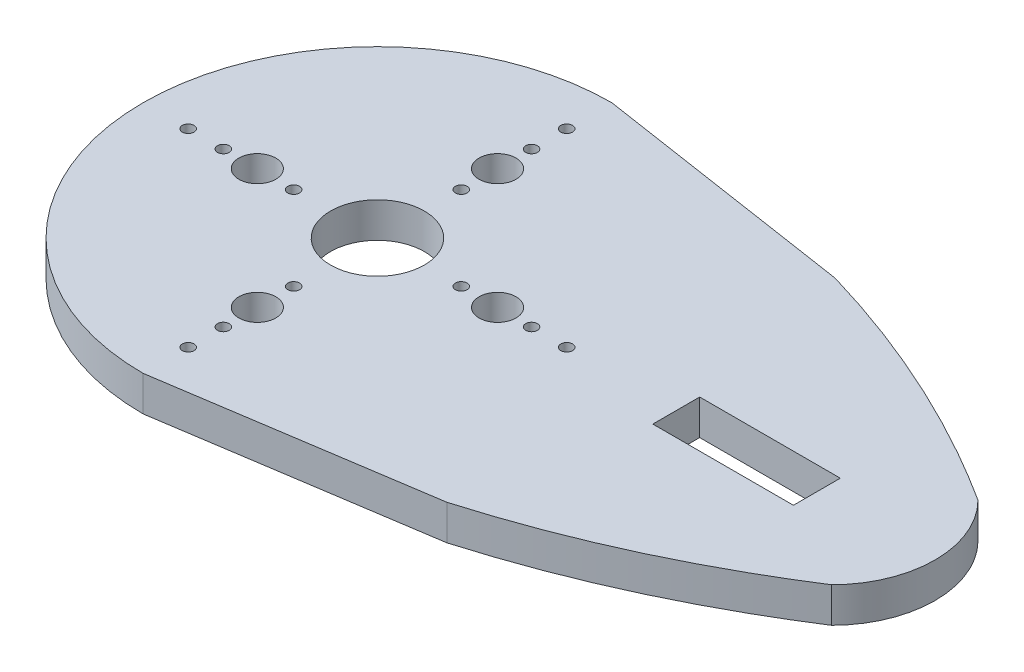
ISO-10303-21;
HEADER;
FILE_DESCRIPTION(('STEP AP214'),'2;1');
FILE_NAME('part.step','',(''),(''),'','','');
FILE_SCHEMA(('AUTOMOTIVE_DESIGN { 1 0 10303 214 1 1 1 1 }'));
ENDSEC;
DATA;
#1=APPLICATION_CONTEXT('core data for automotive mechanical design processes');
#2=APPLICATION_PROTOCOL_DEFINITION('international standard','automotive_design',2000,#1);
#3=PRODUCT_CONTEXT('',#1,'mechanical');
#4=PRODUCT('Part','Part','',(#3));
#5=PRODUCT_RELATED_PRODUCT_CATEGORY('part','',(#4));
#6=PRODUCT_DEFINITION_FORMATION('','',#4);
#7=PRODUCT_DEFINITION_CONTEXT('part definition',#1,'design');
#8=PRODUCT_DEFINITION('design','',#6,#7);
#9=PRODUCT_DEFINITION_SHAPE('','',#8);
#10=(LENGTH_UNIT() NAMED_UNIT(*) SI_UNIT(.MILLI.,.METRE.));
#11=(NAMED_UNIT(*) PLANE_ANGLE_UNIT() SI_UNIT($,.RADIAN.));
#12=(NAMED_UNIT(*) SI_UNIT($,.STERADIAN.) SOLID_ANGLE_UNIT());
#13=UNCERTAINTY_MEASURE_WITH_UNIT(LENGTH_MEASURE(1.E-05),#10,'distance_accuracy_value','');
#14=(GEOMETRIC_REPRESENTATION_CONTEXT(3) GLOBAL_UNCERTAINTY_ASSIGNED_CONTEXT((#13)) GLOBAL_UNIT_ASSIGNED_CONTEXT((#10,
#11,#12)) REPRESENTATION_CONTEXT('',''));
#15=CARTESIAN_POINT('',(0.,0.,0.));
#16=DIRECTION('',(0.,0.,1.));
#17=DIRECTION('',(1.,0.,0.));
#18=AXIS2_PLACEMENT_3D('',#15,#16,#17);
#19=CARTESIAN_POINT('',(0.,3.,2.));
#20=DIRECTION('',(0.,0.,-1.));
#21=DIRECTION('',(-1.,0.,0.));
#22=AXIS2_PLACEMENT_3D('',#19,#20,#21);
#23=PLANE('',#22);
#24=DIRECTION('',(1.,0.,0.));
#25=VECTOR('',#24,1.);
#26=CARTESIAN_POINT('',(0.,0.,2.));
#27=LINE('',#26,#25);
#28=CARTESIAN_POINT('',(25.5,0.,2.));
#29=VERTEX_POINT('',#28);
#30=CARTESIAN_POINT('',(37.5,0.,2.));
#31=VERTEX_POINT('',#30);
#32=EDGE_CURVE('E261',#29,#31,#27,.T.);
#33=ORIENTED_EDGE('',*,*,#32,.F.);
#34=DIRECTION('',(0.,-1.,0.));
#35=VECTOR('',#34,1.);
#36=CARTESIAN_POINT('',(25.5,3.,2.));
#37=LINE('',#36,#35);
#38=CARTESIAN_POINT('',(25.5,3.,2.));
#39=VERTEX_POINT('',#38);
#40=EDGE_CURVE('E11',#39,#29,#37,.T.);
#41=ORIENTED_EDGE('',*,*,#40,.F.);
#42=DIRECTION('',(1.,0.,0.));
#43=VECTOR('',#42,1.);
#44=CARTESIAN_POINT('',(0.,3.,2.));
#45=LINE('',#44,#43);
#46=CARTESIAN_POINT('',(37.5,3.,2.));
#47=VERTEX_POINT('',#46);
#48=EDGE_CURVE('E150',#39,#47,#45,.T.);
#49=ORIENTED_EDGE('',*,*,#48,.T.);
#50=DIRECTION('',(0.,-1.,0.));
#51=VECTOR('',#50,1.);
#52=CARTESIAN_POINT('',(37.5,3.,2.));
#53=LINE('',#52,#51);
#54=EDGE_CURVE('E102',#47,#31,#53,.T.);
#55=ORIENTED_EDGE('',*,*,#54,.T.);
#56=EDGE_LOOP('',(#33,#41,#49,#55));
#57=FACE_BOUND('',#56,.T.);
#58=ADVANCED_FACE('F41',(#57),#23,.T.);
#59=CARTESIAN_POINT('',(25.5,3.,0.));
#60=DIRECTION('',(1.,0.,0.));
#61=DIRECTION('',(0.,0.,-1.));
#62=AXIS2_PLACEMENT_3D('',#59,#60,#61);
#63=PLANE('',#62);
#64=DIRECTION('',(0.,0.,1.));
#65=VECTOR('',#64,1.);
#66=CARTESIAN_POINT('',(25.5,0.,0.));
#67=LINE('',#66,#65);
#68=CARTESIAN_POINT('',(25.5,0.,-2.));
#69=VERTEX_POINT('',#68);
#70=EDGE_CURVE('E137',#69,#29,#67,.T.);
#71=ORIENTED_EDGE('',*,*,#70,.F.);
#72=DIRECTION('',(0.,-1.,0.));
#73=VECTOR('',#72,1.);
#74=CARTESIAN_POINT('',(25.5,3.,-2.));
#75=LINE('',#74,#73);
#76=CARTESIAN_POINT('',(25.5,3.,-2.));
#77=VERTEX_POINT('',#76);
#78=EDGE_CURVE('E52',#77,#69,#75,.T.);
#79=ORIENTED_EDGE('',*,*,#78,.F.);
#80=DIRECTION('',(0.,0.,1.));
#81=VECTOR('',#80,1.);
#82=CARTESIAN_POINT('',(25.5,3.,0.));
#83=LINE('',#82,#81);
#84=EDGE_CURVE('E135',#77,#39,#83,.T.);
#85=ORIENTED_EDGE('',*,*,#84,.T.);
#86=ORIENTED_EDGE('',*,*,#40,.T.);
#87=EDGE_LOOP('',(#71,#79,#85,#86));
#88=FACE_BOUND('',#87,.T.);
#89=ADVANCED_FACE('F133',(#88),#63,.T.);
#90=CARTESIAN_POINT('',(0.,3.,-2.));
#91=DIRECTION('',(0.,0.,-1.));
#92=DIRECTION('',(-1.,0.,0.));
#93=AXIS2_PLACEMENT_3D('',#90,#91,#92);
#94=PLANE('',#93);
#95=DIRECTION('',(1.,0.,0.));
#96=VECTOR('',#95,1.);
#97=CARTESIAN_POINT('',(0.,0.,-2.));
#98=LINE('',#97,#96);
#99=CARTESIAN_POINT('',(37.5,0.,-2.));
#100=VERTEX_POINT('',#99);
#101=EDGE_CURVE('E266',#69,#100,#98,.T.);
#102=ORIENTED_EDGE('',*,*,#101,.T.);
#103=DIRECTION('',(0.,-1.,0.));
#104=VECTOR('',#103,1.);
#105=CARTESIAN_POINT('',(37.5,3.,-2.));
#106=LINE('',#105,#104);
#107=CARTESIAN_POINT('',(37.5,3.,-2.));
#108=VERTEX_POINT('',#107);
#109=EDGE_CURVE('E141',#108,#100,#106,.T.);
#110=ORIENTED_EDGE('',*,*,#109,.F.);
#111=DIRECTION('',(1.,0.,0.));
#112=VECTOR('',#111,1.);
#113=CARTESIAN_POINT('',(0.,3.,-2.));
#114=LINE('',#113,#112);
#115=EDGE_CURVE('E144',#77,#108,#114,.T.);
#116=ORIENTED_EDGE('',*,*,#115,.F.);
#117=ORIENTED_EDGE('',*,*,#78,.T.);
#118=EDGE_LOOP('',(#102,#110,#116,#117));
#119=FACE_BOUND('',#118,.T.);
#120=ADVANCED_FACE('F145',(#119),#94,.F.);
#121=CARTESIAN_POINT('',(0.,3.,20.));
#122=CARTESIAN_POINT('',(24.387763313693,3.,19.4352610275612));
#123=CARTESIAN_POINT('',(45.,3.,6.25));
#124=B_SPLINE_CURVE_WITH_KNOTS('',2,(#121,#122,#123),.UNSPECIFIED.,.F.,.F.,(3,3),(0.,1.),.UNSPECIFIED.);
#125=DIRECTION('',(0.,-1.,0.));
#126=VECTOR('',#125,1.);
#127=SURFACE_OF_LINEAR_EXTRUSION('',#124,#126);
#128=CARTESIAN_POINT('',(0.,0.,20.));
#129=CARTESIAN_POINT('',(24.387763313693,0.,19.4352610275612));
#130=CARTESIAN_POINT('',(45.,0.,6.25));
#131=B_SPLINE_CURVE_WITH_KNOTS('',2,(#128,#129,#130),.UNSPECIFIED.,.F.,.F.,(3,3),(0.,1.),.UNSPECIFIED.);
#132=CARTESIAN_POINT('',(22.4999998561872,0.,16.5625000219714));
#133=VERTEX_POINT('',#132);
#134=CARTESIAN_POINT('',(45.,0.,6.25));
#135=VERTEX_POINT('',#134);
#136=EDGE_CURVE('E201',#133,#135,#131,.T.);
#137=ORIENTED_EDGE('',*,*,#136,.T.);
#138=DIRECTION('',(0.,-1.,0.));
#139=VECTOR('',#138,1.);
#140=CARTESIAN_POINT('',(45.,3.,6.25));
#141=LINE('',#140,#139);
#142=CARTESIAN_POINT('',(45.,3.,6.25));
#143=VERTEX_POINT('',#142);
#144=EDGE_CURVE('E45',#143,#135,#141,.T.);
#145=ORIENTED_EDGE('',*,*,#144,.F.);
#146=CARTESIAN_POINT('',(22.4999998561872,3.,16.5625000219714));
#147=VERTEX_POINT('',#146);
#148=EDGE_CURVE('E110',#147,#143,#124,.T.);
#149=ORIENTED_EDGE('',*,*,#148,.F.);
#150=DIRECTION('',(0.,-1.,0.));
#151=VECTOR('',#150,1.);
#152=CARTESIAN_POINT('',(22.4999998561872,3.,16.5625000219714));
#153=LINE('',#152,#151);
#154=EDGE_CURVE('E180',#147,#133,#153,.T.);
#155=ORIENTED_EDGE('',*,*,#154,.T.);
#156=EDGE_LOOP('',(#137,#145,#149,#155));
#157=FACE_BOUND('',#156,.T.);
#158=ADVANCED_FACE('F321',(#157),#127,.F.);
#159=CARTESIAN_POINT('',(38.75,3.,0.));
#160=DIRECTION('',(0.,-1.,0.));
#161=DIRECTION('',(0.,0.,-1.));
#162=AXIS2_PLACEMENT_3D('',#159,#160,#161);
#163=CYLINDRICAL_SURFACE('',#162,8.83883476483185);
#164=CARTESIAN_POINT('',(38.75,0.,0.));
#165=DIRECTION('',(0.,1.,0.));
#166=DIRECTION('',(0.,0.,1.));
#167=AXIS2_PLACEMENT_3D('',#164,#165,#166);
#168=CIRCLE('',#167,8.83883476483185);
#169=CARTESIAN_POINT('',(45.,0.,-6.25));
#170=VERTEX_POINT('',#169);
#171=EDGE_CURVE('E207',#170,#135,#168,.F.);
#172=ORIENTED_EDGE('',*,*,#171,.F.);
#173=DIRECTION('',(0.,-1.,0.));
#174=VECTOR('',#173,1.);
#175=CARTESIAN_POINT('',(45.,3.,-6.25));
#176=LINE('',#175,#174);
#177=CARTESIAN_POINT('',(45.,3.,-6.25));
#178=VERTEX_POINT('',#177);
#179=EDGE_CURVE('E308',#178,#170,#176,.T.);
#180=ORIENTED_EDGE('',*,*,#179,.F.);
#181=CARTESIAN_POINT('',(38.75,3.,0.));
#182=DIRECTION('',(0.,1.,0.));
#183=DIRECTION('',(0.,0.,1.));
#184=AXIS2_PLACEMENT_3D('',#181,#182,#183);
#185=CIRCLE('',#184,8.83883476483185);
#186=EDGE_CURVE('E318',#178,#143,#185,.F.);
#187=ORIENTED_EDGE('',*,*,#186,.T.);
#188=ORIENTED_EDGE('',*,*,#144,.T.);
#189=EDGE_LOOP('',(#172,#180,#187,#188));
#190=FACE_BOUND('',#189,.T.);
#191=ADVANCED_FACE('F317',(#190),#163,.T.);
#192=CARTESIAN_POINT('',(0.,3.,-20.));
#193=CARTESIAN_POINT('',(24.387763313693,3.,-19.4352610275612));
#194=CARTESIAN_POINT('',(45.,3.,-6.25));
#195=B_SPLINE_CURVE_WITH_KNOTS('',2,(#192,#193,#194),.UNSPECIFIED.,.F.,.F.,(3,3),(0.,1.),.UNSPECIFIED.);
#196=DIRECTION('',(0.,-1.,0.));
#197=VECTOR('',#196,1.);
#198=SURFACE_OF_LINEAR_EXTRUSION('',#195,#197);
#199=CARTESIAN_POINT('',(0.,0.,-20.));
#200=CARTESIAN_POINT('',(24.387763313693,0.,-19.4352610275612));
#201=CARTESIAN_POINT('',(45.,0.,-6.25));
#202=B_SPLINE_CURVE_WITH_KNOTS('',2,(#199,#200,#201),.UNSPECIFIED.,.F.,.F.,(3,3),(0.,1.),.UNSPECIFIED.);
#203=CARTESIAN_POINT('',(22.4999998561872,0.,-16.5625000219714));
#204=VERTEX_POINT('',#203);
#205=EDGE_CURVE('E214',#204,#170,#202,.T.);
#206=ORIENTED_EDGE('',*,*,#205,.F.);
#207=DIRECTION('',(0.,-1.,0.));
#208=VECTOR('',#207,1.);
#209=CARTESIAN_POINT('',(22.4999998561872,3.,-16.5625000219714));
#210=LINE('',#209,#208);
#211=CARTESIAN_POINT('',(22.4999998561872,3.,-16.5625000219714));
#212=VERTEX_POINT('',#211);
#213=EDGE_CURVE('E306',#212,#204,#210,.T.);
#214=ORIENTED_EDGE('',*,*,#213,.F.);
#215=EDGE_CURVE('E331',#212,#178,#195,.T.);
#216=ORIENTED_EDGE('',*,*,#215,.T.);
#217=ORIENTED_EDGE('',*,*,#179,.T.);
#218=EDGE_LOOP('',(#206,#214,#216,#217));
#219=FACE_BOUND('',#218,.T.);
#220=ADVANCED_FACE('F329',(#219),#198,.T.);
#221=CARTESIAN_POINT('',(2.98586239396795,3.,-19.5438265786993));
#222=DIRECTION('',(0.151025398741513,0.,-0.988529882671721));
#223=DIRECTION('',(-0.988529882671721,0.,-0.151025398741513));
#224=AXIS2_PLACEMENT_3D('',#221,#222,#223);
#225=PLANE('',#224);
#226=DIRECTION('',(0.988529882671721,0.,0.151025398741513));
#227=VECTOR('',#226,1.);
#228=CARTESIAN_POINT('',(2.98586239396795,0.,-19.5438265786993));
#229=LINE('',#228,#227);
#230=CARTESIAN_POINT('',(0.,0.,-20.));
#231=VERTEX_POINT('',#230);
#232=EDGE_CURVE('E220',#231,#204,#229,.T.);
#233=ORIENTED_EDGE('',*,*,#232,.F.);
#234=DIRECTION('',(0.,-1.,0.));
#235=VECTOR('',#234,1.);
#236=CARTESIAN_POINT('',(0.,3.,-20.));
#237=LINE('',#236,#235);
#238=CARTESIAN_POINT('',(0.,3.,-20.));
#239=VERTEX_POINT('',#238);
#240=EDGE_CURVE('E303',#239,#231,#237,.T.);
#241=ORIENTED_EDGE('',*,*,#240,.F.);
#242=DIRECTION('',(0.988529882671721,0.,0.151025398741513));
#243=VECTOR('',#242,1.);
#244=CARTESIAN_POINT('',(2.98586239396795,3.,-19.5438265786993));
#245=LINE('',#244,#243);
#246=EDGE_CURVE('E336',#239,#212,#245,.T.);
#247=ORIENTED_EDGE('',*,*,#246,.T.);
#248=ORIENTED_EDGE('',*,*,#213,.T.);
#249=EDGE_LOOP('',(#233,#241,#247,#248));
#250=FACE_BOUND('',#249,.T.);
#251=ADVANCED_FACE('F339',(#250),#225,.T.);
#252=CARTESIAN_POINT('',(0.,3.,0.));
#253=DIRECTION('',(0.,-1.,0.));
#254=DIRECTION('',(0.,0.,-1.));
#255=AXIS2_PLACEMENT_3D('',#252,#253,#254);
#256=CYLINDRICAL_SURFACE('',#255,20.);
#257=CARTESIAN_POINT('',(0.,0.,0.));
#258=DIRECTION('',(0.,1.,0.));
#259=DIRECTION('',(0.,0.,1.));
#260=AXIS2_PLACEMENT_3D('',#257,#258,#259);
#261=CIRCLE('',#260,20.);
#262=CARTESIAN_POINT('',(0.,0.,20.));
#263=VERTEX_POINT('',#262);
#264=EDGE_CURVE('E227',#231,#263,#261,.T.);
#265=ORIENTED_EDGE('',*,*,#264,.T.);
#266=DIRECTION('',(0.,-1.,0.));
#267=VECTOR('',#266,1.);
#268=CARTESIAN_POINT('',(0.,3.,20.));
#269=LINE('',#268,#267);
#270=CARTESIAN_POINT('',(0.,3.,20.));
#271=VERTEX_POINT('',#270);
#272=EDGE_CURVE('E299',#271,#263,#269,.T.);
#273=ORIENTED_EDGE('',*,*,#272,.F.);
#274=CARTESIAN_POINT('',(0.,3.,0.));
#275=DIRECTION('',(0.,1.,0.));
#276=DIRECTION('',(0.,0.,1.));
#277=AXIS2_PLACEMENT_3D('',#274,#275,#276);
#278=CIRCLE('',#277,20.);
#279=EDGE_CURVE('E342',#239,#271,#278,.T.);
#280=ORIENTED_EDGE('',*,*,#279,.F.);
#281=ORIENTED_EDGE('',*,*,#240,.T.);
#282=EDGE_LOOP('',(#265,#273,#280,#281));
#283=FACE_BOUND('',#282,.T.);
#284=ADVANCED_FACE('F438',(#283),#256,.T.);
#285=CARTESIAN_POINT('',(-13.15,3.,0.));
#286=DIRECTION('',(0.,-1.,0.));
#287=DIRECTION('',(0.,0.,-1.));
#288=AXIS2_PLACEMENT_3D('',#285,#286,#287);
#289=CYLINDRICAL_SURFACE('',#288,0.500000000000001);
#290=CARTESIAN_POINT('',(-13.15,3.,0.));
#291=DIRECTION('',(0.,1.,0.));
#292=DIRECTION('',(0.,0.,1.));
#293=AXIS2_PLACEMENT_3D('',#290,#291,#292);
#294=CIRCLE('',#293,0.500000000000001);
#295=CARTESIAN_POINT('',(-13.15,3.,0.500000000000001));
#296=VERTEX_POINT('',#295);
#297=EDGE_CURVE('E172',#296,#296,#294,.T.);
#298=ORIENTED_EDGE('',*,*,#297,.T.);
#299=EDGE_LOOP('',(#298));
#300=FACE_BOUND('',#299,.T.);
#301=CARTESIAN_POINT('',(-13.15,0.,0.));
#302=DIRECTION('',(0.,1.,0.));
#303=DIRECTION('',(0.,0.,1.));
#304=AXIS2_PLACEMENT_3D('',#301,#302,#303);
#305=CIRCLE('',#304,0.500000000000001);
#306=CARTESIAN_POINT('',(-13.15,0.,0.500000000000001));
#307=VERTEX_POINT('',#306);
#308=EDGE_CURVE('E283',#307,#307,#305,.T.);
#309=ORIENTED_EDGE('',*,*,#308,.F.);
#310=EDGE_LOOP('',(#309));
#311=FACE_BOUND('',#310,.T.);
#312=ADVANCED_FACE('F441',(#300,#311),#289,.F.);
#313=CARTESIAN_POINT('',(-10.25,3.,0.));
#314=DIRECTION('',(0.,-1.,0.));
#315=DIRECTION('',(0.,0.,-1.));
#316=AXIS2_PLACEMENT_3D('',#313,#314,#315);
#317=CYLINDRICAL_SURFACE('',#316,1.575);
#318=CARTESIAN_POINT('',(-10.25,3.,0.));
#319=DIRECTION('',(0.,1.,0.));
#320=DIRECTION('',(0.,0.,1.));
#321=AXIS2_PLACEMENT_3D('',#318,#319,#320);
#322=CIRCLE('',#321,1.575);
#323=CARTESIAN_POINT('',(-10.25,3.,1.57499999999993));
#324=VERTEX_POINT('',#323);
#325=EDGE_CURVE('E168',#324,#324,#322,.T.);
#326=ORIENTED_EDGE('',*,*,#325,.T.);
#327=EDGE_LOOP('',(#326));
#328=FACE_BOUND('',#327,.T.);
#329=CARTESIAN_POINT('',(-10.25,0.,0.));
#330=DIRECTION('',(0.,1.,0.));
#331=DIRECTION('',(0.,0.,1.));
#332=AXIS2_PLACEMENT_3D('',#329,#330,#331);
#333=CIRCLE('',#332,1.575);
#334=CARTESIAN_POINT('',(-10.25,0.,1.57499999999993));
#335=VERTEX_POINT('',#334);
#336=EDGE_CURVE('E279',#335,#335,#333,.T.);
#337=ORIENTED_EDGE('',*,*,#336,.F.);
#338=EDGE_LOOP('',(#337));
#339=FACE_BOUND('',#338,.T.);
#340=ADVANCED_FACE('F643',(#328,#339),#317,.F.);
#341=CARTESIAN_POINT('',(-7.15,3.,0.));
#342=DIRECTION('',(0.,-1.,0.));
#343=DIRECTION('',(0.,0.,-1.));
#344=AXIS2_PLACEMENT_3D('',#341,#342,#343);
#345=CYLINDRICAL_SURFACE('',#344,0.500000000000001);
#346=CARTESIAN_POINT('',(-7.15,3.,0.));
#347=DIRECTION('',(0.,1.,0.));
#348=DIRECTION('',(0.,0.,1.));
#349=AXIS2_PLACEMENT_3D('',#346,#347,#348);
#350=CIRCLE('',#349,0.500000000000001);
#351=CARTESIAN_POINT('',(-7.15,3.,0.5));
#352=VERTEX_POINT('',#351);
#353=EDGE_CURVE('E164',#352,#352,#350,.T.);
#354=ORIENTED_EDGE('',*,*,#353,.T.);
#355=EDGE_LOOP('',(#354));
#356=FACE_BOUND('',#355,.T.);
#357=CARTESIAN_POINT('',(-7.15,0.,0.));
#358=DIRECTION('',(0.,1.,0.));
#359=DIRECTION('',(0.,0.,1.));
#360=AXIS2_PLACEMENT_3D('',#357,#358,#359);
#361=CIRCLE('',#360,0.500000000000001);
#362=CARTESIAN_POINT('',(-7.15,0.,0.5));
#363=VERTEX_POINT('',#362);
#364=EDGE_CURVE('E275',#363,#363,#361,.T.);
#365=ORIENTED_EDGE('',*,*,#364,.F.);
#366=EDGE_LOOP('',(#365));
#367=FACE_BOUND('',#366,.T.);
#368=ADVANCED_FACE('F634',(#356,#367),#345,.F.);
#369=CARTESIAN_POINT('',(0.,3.,-7.15));
#370=DIRECTION('',(0.,-1.,0.));
#371=DIRECTION('',(0.,0.,-1.));
#372=AXIS2_PLACEMENT_3D('',#369,#370,#371);
#373=CYLINDRICAL_SURFACE('',#372,0.500000000000001);
#374=CARTESIAN_POINT('',(0.,3.,-7.15));
#375=DIRECTION('',(0.,1.,0.));
#376=DIRECTION('',(0.,0.,1.));
#377=AXIS2_PLACEMENT_3D('',#374,#375,#376);
#378=CIRCLE('',#377,0.500000000000001);
#379=CARTESIAN_POINT('',(0.,3.,-6.65));
#380=VERTEX_POINT('',#379);
#381=EDGE_CURVE('E160',#380,#380,#378,.T.);
#382=ORIENTED_EDGE('',*,*,#381,.T.);
#383=EDGE_LOOP('',(#382));
#384=FACE_BOUND('',#383,.T.);
#385=CARTESIAN_POINT('',(0.,0.,-7.15));
#386=DIRECTION('',(0.,1.,0.));
#387=DIRECTION('',(0.,0.,1.));
#388=AXIS2_PLACEMENT_3D('',#385,#386,#387);
#389=CIRCLE('',#388,0.500000000000001);
#390=CARTESIAN_POINT('',(0.,0.,-6.65));
#391=VERTEX_POINT('',#390);
#392=EDGE_CURVE('E271',#391,#391,#389,.T.);
#393=ORIENTED_EDGE('',*,*,#392,.F.);
#394=EDGE_LOOP('',(#393));
#395=FACE_BOUND('',#394,.T.);
#396=ADVANCED_FACE('F625',(#384,#395),#373,.F.);
#397=CARTESIAN_POINT('',(37.5,3.,0.));
#398=DIRECTION('',(1.,0.,0.));
#399=DIRECTION('',(0.,0.,-1.));
#400=AXIS2_PLACEMENT_3D('',#397,#398,#399);
#401=PLANE('',#400);
#402=DIRECTION('',(0.,0.,1.));
#403=VECTOR('',#402,1.);
#404=CARTESIAN_POINT('',(37.5,0.,0.));
#405=LINE('',#404,#403);
#406=EDGE_CURVE('E95',#100,#31,#405,.T.);
#407=ORIENTED_EDGE('',*,*,#406,.T.);
#408=ORIENTED_EDGE('',*,*,#54,.F.);
#409=DIRECTION('',(0.,0.,1.));
#410=VECTOR('',#409,1.);
#411=CARTESIAN_POINT('',(37.5,3.,0.));
#412=LINE('',#411,#410);
#413=EDGE_CURVE('E61',#108,#47,#412,.T.);
#414=ORIENTED_EDGE('',*,*,#413,.F.);
#415=ORIENTED_EDGE('',*,*,#109,.T.);
#416=EDGE_LOOP('',(#407,#408,#414,#415));
#417=FACE_BOUND('',#416,.T.);
#418=ADVANCED_FACE('F409',(#417),#401,.F.);
#419=CARTESIAN_POINT('',(16.15,3.,1.12396237623543E-13));
#420=DIRECTION('',(0.,-1.,0.));
#421=DIRECTION('',(0.,0.,-1.));
#422=AXIS2_PLACEMENT_3D('',#419,#420,#421);
#423=CYLINDRICAL_SURFACE('',#422,0.499999999999998);
#424=CARTESIAN_POINT('',(16.15,3.,1.12396237623543E-13));
#425=DIRECTION('',(0.,1.,0.));
#426=DIRECTION('',(0.,0.,1.));
#427=AXIS2_PLACEMENT_3D('',#424,#425,#426);
#428=CIRCLE('',#427,0.499999999999998);
#429=CARTESIAN_POINT('',(16.15,3.,0.500000000000111));
#430=VERTEX_POINT('',#429);
#431=EDGE_CURVE('E154',#430,#430,#428,.T.);
#432=ORIENTED_EDGE('',*,*,#431,.T.);
#433=EDGE_LOOP('',(#432));
#434=FACE_BOUND('',#433,.T.);
#435=CARTESIAN_POINT('',(16.15,0.,1.12396237623543E-13));
#436=DIRECTION('',(0.,1.,0.));
#437=DIRECTION('',(0.,0.,1.));
#438=AXIS2_PLACEMENT_3D('',#435,#436,#437);
#439=CIRCLE('',#438,0.499999999999998);
#440=CARTESIAN_POINT('',(16.15,0.,0.500000000000111));
#441=VERTEX_POINT('',#440);
#442=EDGE_CURVE('E257',#441,#441,#439,.T.);
#443=ORIENTED_EDGE('',*,*,#442,.F.);
#444=EDGE_LOOP('',(#443));
#445=FACE_BOUND('',#444,.T.);
#446=ADVANCED_FACE('F381',(#434,#445),#423,.F.);
#447=CARTESIAN_POINT('',(13.15,3.,0.));
#448=DIRECTION('',(0.,-1.,0.));
#449=DIRECTION('',(0.,0.,-1.));
#450=AXIS2_PLACEMENT_3D('',#447,#448,#449);
#451=CYLINDRICAL_SURFACE('',#450,0.500000000000001);
#452=CARTESIAN_POINT('',(13.15,3.,0.));
#453=DIRECTION('',(0.,1.,0.));
#454=DIRECTION('',(0.,0.,1.));
#455=AXIS2_PLACEMENT_3D('',#452,#453,#454);
#456=CIRCLE('',#455,0.500000000000001);
#457=CARTESIAN_POINT('',(13.15,3.,0.500000000000093));
#458=VERTEX_POINT('',#457);
#459=EDGE_CURVE('E374',#458,#458,#456,.T.);
#460=ORIENTED_EDGE('',*,*,#459,.T.);
#461=EDGE_LOOP('',(#460));
#462=FACE_BOUND('',#461,.T.);
#463=CARTESIAN_POINT('',(13.15,0.,0.));
#464=DIRECTION('',(0.,1.,0.));
#465=DIRECTION('',(0.,0.,1.));
#466=AXIS2_PLACEMENT_3D('',#463,#464,#465);
#467=CIRCLE('',#466,0.500000000000001);
#468=CARTESIAN_POINT('',(13.15,0.,0.500000000000093));
#469=VERTEX_POINT('',#468);
#470=EDGE_CURVE('E253',#469,#469,#467,.T.);
#471=ORIENTED_EDGE('',*,*,#470,.F.);
#472=EDGE_LOOP('',(#471));
#473=FACE_BOUND('',#472,.T.);
#474=ADVANCED_FACE('F408',(#462,#473),#451,.F.);
#475=CARTESIAN_POINT('',(10.25,3.,0.));
#476=DIRECTION('',(0.,-1.,0.));
#477=DIRECTION('',(0.,0.,-1.));
#478=AXIS2_PLACEMENT_3D('',#475,#476,#477);
#479=CYLINDRICAL_SURFACE('',#478,1.575);
#480=CARTESIAN_POINT('',(10.25,3.,0.));
#481=DIRECTION('',(0.,1.,0.));
#482=DIRECTION('',(0.,0.,1.));
#483=AXIS2_PLACEMENT_3D('',#480,#481,#482);
#484=CIRCLE('',#483,1.575);
#485=CARTESIAN_POINT('',(10.25,3.,1.575));
#486=VERTEX_POINT('',#485);
#487=EDGE_CURVE('E370',#486,#486,#484,.T.);
#488=ORIENTED_EDGE('',*,*,#487,.T.);
#489=EDGE_LOOP('',(#488));
#490=FACE_BOUND('',#489,.T.);
#491=CARTESIAN_POINT('',(10.25,0.,0.));
#492=DIRECTION('',(0.,1.,0.));
#493=DIRECTION('',(0.,0.,1.));
#494=AXIS2_PLACEMENT_3D('',#491,#492,#493);
#495=CIRCLE('',#494,1.575);
#496=CARTESIAN_POINT('',(10.25,0.,1.575));
#497=VERTEX_POINT('',#496);
#498=EDGE_CURVE('E249',#497,#497,#495,.T.);
#499=ORIENTED_EDGE('',*,*,#498,.F.);
#500=EDGE_LOOP('',(#499));
#501=FACE_BOUND('',#500,.T.);
#502=ADVANCED_FACE('F412',(#490,#501),#479,.F.);
#503=CARTESIAN_POINT('',(7.15,3.,0.));
#504=DIRECTION('',(0.,-1.,0.));
#505=DIRECTION('',(0.,0.,-1.));
#506=AXIS2_PLACEMENT_3D('',#503,#504,#505);
#507=CYLINDRICAL_SURFACE('',#506,0.500000000000001);
#508=CARTESIAN_POINT('',(7.15,3.,0.));
#509=DIRECTION('',(0.,1.,0.));
#510=DIRECTION('',(0.,0.,1.));
#511=AXIS2_PLACEMENT_3D('',#508,#509,#510);
#512=CIRCLE('',#511,0.500000000000001);
#513=CARTESIAN_POINT('',(7.15,3.,0.500000000000051));
#514=VERTEX_POINT('',#513);
#515=EDGE_CURVE('E366',#514,#514,#512,.T.);
#516=ORIENTED_EDGE('',*,*,#515,.T.);
#517=EDGE_LOOP('',(#516));
#518=FACE_BOUND('',#517,.T.);
#519=CARTESIAN_POINT('',(7.15,0.,0.));
#520=DIRECTION('',(0.,1.,0.));
#521=DIRECTION('',(0.,0.,1.));
#522=AXIS2_PLACEMENT_3D('',#519,#520,#521);
#523=CIRCLE('',#522,0.500000000000001);
#524=CARTESIAN_POINT('',(7.15,0.,0.500000000000051));
#525=VERTEX_POINT('',#524);
#526=EDGE_CURVE('E245',#525,#525,#523,.T.);
#527=ORIENTED_EDGE('',*,*,#526,.F.);
#528=EDGE_LOOP('',(#527));
#529=FACE_BOUND('',#528,.T.);
#530=ADVANCED_FACE('F416',(#518,#529),#507,.F.);
#531=CARTESIAN_POINT('',(1.07363051169426E-13,3.,-10.25));
#532=DIRECTION('',(0.,-1.,0.));
#533=DIRECTION('',(0.,0.,-1.));
#534=AXIS2_PLACEMENT_3D('',#531,#532,#533);
#535=CYLINDRICAL_SURFACE('',#534,1.575);
#536=CARTESIAN_POINT('',(1.07363051169426E-13,3.,-10.25));
#537=DIRECTION('',(0.,1.,0.));
#538=DIRECTION('',(0.,0.,1.));
#539=AXIS2_PLACEMENT_3D('',#536,#537,#538);
#540=CIRCLE('',#539,1.575);
#541=CARTESIAN_POINT('',(1.07363051169426E-13,3.,-8.675));
#542=VERTEX_POINT('',#541);
#543=EDGE_CURVE('E362',#542,#542,#540,.T.);
#544=ORIENTED_EDGE('',*,*,#543,.T.);
#545=EDGE_LOOP('',(#544));
#546=FACE_BOUND('',#545,.T.);
#547=CARTESIAN_POINT('',(1.07363051169426E-13,0.,-10.25));
#548=DIRECTION('',(0.,1.,0.));
#549=DIRECTION('',(0.,0.,1.));
#550=AXIS2_PLACEMENT_3D('',#547,#548,#549);
#551=CIRCLE('',#550,1.575);
#552=CARTESIAN_POINT('',(1.07363051169426E-13,0.,-8.675));
#553=VERTEX_POINT('',#552);
#554=EDGE_CURVE('E241',#553,#553,#551,.T.);
#555=ORIENTED_EDGE('',*,*,#554,.F.);
#556=EDGE_LOOP('',(#555));
#557=FACE_BOUND('',#556,.T.);
#558=ADVANCED_FACE('F420',(#546,#557),#535,.F.);
#559=CARTESIAN_POINT('',(0.,3.,-13.15));
#560=DIRECTION('',(0.,-1.,0.));
#561=DIRECTION('',(0.,0.,-1.));
#562=AXIS2_PLACEMENT_3D('',#559,#560,#561);
#563=CYLINDRICAL_SURFACE('',#562,0.5);
#564=CARTESIAN_POINT('',(0.,3.,-13.15));
#565=DIRECTION('',(0.,1.,0.));
#566=DIRECTION('',(0.,0.,1.));
#567=AXIS2_PLACEMENT_3D('',#564,#565,#566);
#568=CIRCLE('',#567,0.5);
#569=CARTESIAN_POINT('',(0.,3.,-12.65));
#570=VERTEX_POINT('',#569);
#571=EDGE_CURVE('E358',#570,#570,#568,.T.);
#572=ORIENTED_EDGE('',*,*,#571,.T.);
#573=EDGE_LOOP('',(#572));
#574=FACE_BOUND('',#573,.T.);
#575=CARTESIAN_POINT('',(0.,0.,-13.15));
#576=DIRECTION('',(0.,1.,0.));
#577=DIRECTION('',(0.,0.,1.));
#578=AXIS2_PLACEMENT_3D('',#575,#576,#577);
#579=CIRCLE('',#578,0.5);
#580=CARTESIAN_POINT('',(0.,0.,-12.65));
#581=VERTEX_POINT('',#580);
#582=EDGE_CURVE('E237',#581,#581,#579,.T.);
#583=ORIENTED_EDGE('',*,*,#582,.F.);
#584=EDGE_LOOP('',(#583));
#585=FACE_BOUND('',#584,.T.);
#586=ADVANCED_FACE('F424',(#574,#585),#563,.F.);
#587=CARTESIAN_POINT('',(0.,3.,-16.15));
#588=DIRECTION('',(0.,-1.,0.));
#589=DIRECTION('',(0.,0.,-1.));
#590=AXIS2_PLACEMENT_3D('',#587,#588,#589);
#591=CYLINDRICAL_SURFACE('',#590,0.499999999999999);
#592=CARTESIAN_POINT('',(0.,3.,-16.15));
#593=DIRECTION('',(0.,1.,0.));
#594=DIRECTION('',(0.,0.,1.));
#595=AXIS2_PLACEMENT_3D('',#592,#593,#594);
#596=CIRCLE('',#595,0.499999999999999);
#597=CARTESIAN_POINT('',(0.,3.,-15.65));
#598=VERTEX_POINT('',#597);
#599=EDGE_CURVE('E354',#598,#598,#596,.T.);
#600=ORIENTED_EDGE('',*,*,#599,.T.);
#601=EDGE_LOOP('',(#600));
#602=FACE_BOUND('',#601,.T.);
#603=CARTESIAN_POINT('',(0.,0.,-16.15));
#604=DIRECTION('',(0.,1.,0.));
#605=DIRECTION('',(0.,0.,1.));
#606=AXIS2_PLACEMENT_3D('',#603,#604,#605);
#607=CIRCLE('',#606,0.499999999999999);
#608=CARTESIAN_POINT('',(0.,0.,-15.65));
#609=VERTEX_POINT('',#608);
#610=EDGE_CURVE('E233',#609,#609,#607,.T.);
#611=ORIENTED_EDGE('',*,*,#610,.F.);
#612=EDGE_LOOP('',(#611));
#613=FACE_BOUND('',#612,.T.);
#614=ADVANCED_FACE('F428',(#602,#613),#591,.F.);
#615=CARTESIAN_POINT('',(2.98586239396795,3.,19.5438265786993));
#616=DIRECTION('',(-0.151025398741513,0.,-0.988529882671721));
#617=DIRECTION('',(-0.988529882671721,0.,0.151025398741513));
#618=AXIS2_PLACEMENT_3D('',#615,#616,#617);
#619=PLANE('',#618);
#620=DIRECTION('',(0.988529882671721,0.,-0.151025398741513));
#621=VECTOR('',#620,1.);
#622=CARTESIAN_POINT('',(2.98586239396795,0.,19.5438265786993));
#623=LINE('',#622,#621);
#624=EDGE_CURVE('E230',#263,#133,#623,.T.);
#625=ORIENTED_EDGE('',*,*,#624,.T.);
#626=ORIENTED_EDGE('',*,*,#154,.F.);
#627=DIRECTION('',(0.988529882671721,0.,-0.151025398741513));
#628=VECTOR('',#627,1.);
#629=CARTESIAN_POINT('',(2.98586239396795,3.,19.5438265786993));
#630=LINE('',#629,#628);
#631=EDGE_CURVE('E345',#271,#147,#630,.T.);
#632=ORIENTED_EDGE('',*,*,#631,.F.);
#633=ORIENTED_EDGE('',*,*,#272,.T.);
#634=EDGE_LOOP('',(#625,#626,#632,#633));
#635=FACE_BOUND('',#634,.T.);
#636=ADVANCED_FACE('F432',(#635),#619,.F.);
#637=CARTESIAN_POINT('',(-1.69651022983848E-13,3.,16.15));
#638=DIRECTION('',(0.,-1.,0.));
#639=DIRECTION('',(0.,0.,-1.));
#640=AXIS2_PLACEMENT_3D('',#637,#638,#639);
#641=CYLINDRICAL_SURFACE('',#640,0.499999999999998);
#642=CARTESIAN_POINT('',(-1.69651022983848E-13,3.,16.15));
#643=DIRECTION('',(0.,1.,0.));
#644=DIRECTION('',(0.,0.,1.));
#645=AXIS2_PLACEMENT_3D('',#642,#643,#644);
#646=CIRCLE('',#645,0.499999999999998);
#647=CARTESIAN_POINT('',(-1.69651022983848E-13,3.,16.65));
#648=VERTEX_POINT('',#647);
#649=EDGE_CURVE('E458',#648,#648,#646,.T.);
#650=ORIENTED_EDGE('',*,*,#649,.T.);
#651=EDGE_LOOP('',(#650));
#652=FACE_BOUND('',#651,.T.);
#653=CARTESIAN_POINT('',(-1.69651022983848E-13,0.,16.15));
#654=DIRECTION('',(0.,1.,0.));
#655=DIRECTION('',(0.,0.,1.));
#656=AXIS2_PLACEMENT_3D('',#653,#654,#655);
#657=CIRCLE('',#656,0.499999999999998);
#658=CARTESIAN_POINT('',(-1.69651022983848E-13,0.,16.65));
#659=VERTEX_POINT('',#658);
#660=EDGE_CURVE('E197',#659,#659,#657,.T.);
#661=ORIENTED_EDGE('',*,*,#660,.F.);
#662=EDGE_LOOP('',(#661));
#663=FACE_BOUND('',#662,.T.);
#664=ADVANCED_FACE('F436',(#652,#663),#641,.F.);
#665=CARTESIAN_POINT('',(-1.38233298724933E-13,3.,13.15));
#666=DIRECTION('',(0.,-1.,0.));
#667=DIRECTION('',(0.,0.,-1.));
#668=AXIS2_PLACEMENT_3D('',#665,#666,#667);
#669=CYLINDRICAL_SURFACE('',#668,0.500000000000001);
#670=CARTESIAN_POINT('',(-1.38233298724933E-13,3.,13.15));
#671=DIRECTION('',(0.,1.,0.));
#672=DIRECTION('',(0.,0.,1.));
#673=AXIS2_PLACEMENT_3D('',#670,#671,#672);
#674=CIRCLE('',#673,0.500000000000001);
#675=CARTESIAN_POINT('',(-1.38233298724933E-13,3.,13.65));
#676=VERTEX_POINT('',#675);
#677=EDGE_CURVE('E467',#676,#676,#674,.T.);
#678=ORIENTED_EDGE('',*,*,#677,.T.);
#679=EDGE_LOOP('',(#678));
#680=FACE_BOUND('',#679,.T.);
#681=CARTESIAN_POINT('',(-1.38233298724933E-13,0.,13.15));
#682=DIRECTION('',(0.,1.,0.));
#683=DIRECTION('',(0.,0.,1.));
#684=AXIS2_PLACEMENT_3D('',#681,#682,#683);
#685=CIRCLE('',#684,0.500000000000001);
#686=CARTESIAN_POINT('',(-1.38233298724933E-13,0.,13.65));
#687=VERTEX_POINT('',#686);
#688=EDGE_CURVE('E193',#687,#687,#685,.T.);
#689=ORIENTED_EDGE('',*,*,#688,.F.);
#690=EDGE_LOOP('',(#689));
#691=FACE_BOUND('',#690,.T.);
#692=ADVANCED_FACE('F495',(#680,#691),#669,.F.);
#693=CARTESIAN_POINT('',(0.,3.,10.25));
#694=DIRECTION('',(0.,-1.,0.));
#695=DIRECTION('',(0.,0.,-1.));
#696=AXIS2_PLACEMENT_3D('',#693,#694,#695);
#697=CYLINDRICAL_SURFACE('',#696,1.575);
#698=CARTESIAN_POINT('',(0.,3.,10.25));
#699=DIRECTION('',(0.,1.,0.));
#700=DIRECTION('',(0.,0.,1.));
#701=AXIS2_PLACEMENT_3D('',#698,#699,#700);
#702=CIRCLE('',#701,1.575);
#703=CARTESIAN_POINT('',(0.,3.,11.825));
#704=VERTEX_POINT('',#703);
#705=EDGE_CURVE('E470',#704,#704,#702,.T.);
#706=ORIENTED_EDGE('',*,*,#705,.T.);
#707=EDGE_LOOP('',(#706));
#708=FACE_BOUND('',#707,.T.);
#709=CARTESIAN_POINT('',(0.,0.,10.25));
#710=DIRECTION('',(0.,1.,0.));
#711=DIRECTION('',(0.,0.,1.));
#712=AXIS2_PLACEMENT_3D('',#709,#710,#711);
#713=CIRCLE('',#712,1.575);
#714=CARTESIAN_POINT('',(0.,0.,11.825));
#715=VERTEX_POINT('',#714);
#716=EDGE_CURVE('E189',#715,#715,#713,.T.);
#717=ORIENTED_EDGE('',*,*,#716,.F.);
#718=EDGE_LOOP('',(#717));
#719=FACE_BOUND('',#718,.T.);
#720=ADVANCED_FACE('F500',(#708,#719),#697,.F.);
#721=CARTESIAN_POINT('',(0.,3.,7.15));
#722=DIRECTION('',(0.,-1.,0.));
#723=DIRECTION('',(0.,0.,-1.));
#724=AXIS2_PLACEMENT_3D('',#721,#722,#723);
#725=CYLINDRICAL_SURFACE('',#724,0.500000000000001);
#726=CARTESIAN_POINT('',(0.,3.,7.15));
#727=DIRECTION('',(0.,1.,0.));
#728=DIRECTION('',(0.,0.,1.));
#729=AXIS2_PLACEMENT_3D('',#726,#727,#728);
#730=CIRCLE('',#729,0.500000000000001);
#731=CARTESIAN_POINT('',(0.,3.,7.65));
#732=VERTEX_POINT('',#731);
#733=EDGE_CURVE('E473',#732,#732,#730,.T.);
#734=ORIENTED_EDGE('',*,*,#733,.T.);
#735=EDGE_LOOP('',(#734));
#736=FACE_BOUND('',#735,.T.);
#737=CARTESIAN_POINT('',(0.,0.,7.15));
#738=DIRECTION('',(0.,1.,0.));
#739=DIRECTION('',(0.,0.,1.));
#740=AXIS2_PLACEMENT_3D('',#737,#738,#739);
#741=CIRCLE('',#740,0.500000000000001);
#742=CARTESIAN_POINT('',(0.,0.,7.65));
#743=VERTEX_POINT('',#742);
#744=EDGE_CURVE('E185',#743,#743,#741,.T.);
#745=ORIENTED_EDGE('',*,*,#744,.F.);
#746=EDGE_LOOP('',(#745));
#747=FACE_BOUND('',#746,.T.);
#748=ADVANCED_FACE('F483',(#736,#747),#725,.F.);
#749=CARTESIAN_POINT('',(0.,3.,0.));
#750=DIRECTION('',(0.,-1.,0.));
#751=DIRECTION('',(0.,0.,-1.));
#752=AXIS2_PLACEMENT_3D('',#749,#750,#751);
#753=CYLINDRICAL_SURFACE('',#752,4.);
#754=CARTESIAN_POINT('',(0.,3.,0.));
#755=DIRECTION('',(0.,1.,0.));
#756=DIRECTION('',(0.,0.,1.));
#757=AXIS2_PLACEMENT_3D('',#754,#755,#756);
#758=CIRCLE('',#757,4.);
#759=CARTESIAN_POINT('',(0.,3.,4.));
#760=VERTEX_POINT('',#759);
#761=EDGE_CURVE('E291',#760,#760,#758,.T.);
#762=ORIENTED_EDGE('',*,*,#761,.T.);
#763=EDGE_LOOP('',(#762));
#764=FACE_BOUND('',#763,.T.);
#765=CARTESIAN_POINT('',(0.,0.,0.));
#766=DIRECTION('',(0.,1.,0.));
#767=DIRECTION('',(0.,0.,1.));
#768=AXIS2_PLACEMENT_3D('',#765,#766,#767);
#769=CIRCLE('',#768,4.);
#770=CARTESIAN_POINT('',(0.,0.,4.));
#771=VERTEX_POINT('',#770);
#772=EDGE_CURVE('E181',#771,#771,#769,.T.);
#773=ORIENTED_EDGE('',*,*,#772,.F.);
#774=EDGE_LOOP('',(#773));
#775=FACE_BOUND('',#774,.T.);
#776=ADVANCED_FACE('F43',(#764,#775),#753,.F.);
#777=CARTESIAN_POINT('',(-16.15,3.,0.));
#778=DIRECTION('',(0.,-1.,0.));
#779=DIRECTION('',(0.,0.,-1.));
#780=AXIS2_PLACEMENT_3D('',#777,#778,#779);
#781=CYLINDRICAL_SURFACE('',#780,0.499999999999999);
#782=CARTESIAN_POINT('',(-16.15,3.,0.));
#783=DIRECTION('',(0.,1.,0.));
#784=DIRECTION('',(0.,0.,1.));
#785=AXIS2_PLACEMENT_3D('',#782,#783,#784);
#786=CIRCLE('',#785,0.499999999999999);
#787=CARTESIAN_POINT('',(-16.15,3.,0.499999999999999));
#788=VERTEX_POINT('',#787);
#789=EDGE_CURVE('E176',#788,#788,#786,.T.);
#790=ORIENTED_EDGE('',*,*,#789,.T.);
#791=EDGE_LOOP('',(#790));
#792=FACE_BOUND('',#791,.T.);
#793=CARTESIAN_POINT('',(-16.15,0.,0.));
#794=DIRECTION('',(0.,1.,0.));
#795=DIRECTION('',(0.,0.,1.));
#796=AXIS2_PLACEMENT_3D('',#793,#794,#795);
#797=CIRCLE('',#796,0.499999999999999);
#798=CARTESIAN_POINT('',(-16.15,0.,0.499999999999999));
#799=VERTEX_POINT('',#798);
#800=EDGE_CURVE('E287',#799,#799,#797,.T.);
#801=ORIENTED_EDGE('',*,*,#800,.F.);
#802=EDGE_LOOP('',(#801));
#803=FACE_BOUND('',#802,.T.);
#804=ADVANCED_FACE('F385',(#792,#803),#781,.F.);
#805=CARTESIAN_POINT('',(0.,3.,0.));
#806=DIRECTION('',(0.,1.,0.));
#807=DIRECTION('',(0.,0.,1.));
#808=AXIS2_PLACEMENT_3D('',#805,#806,#807);
#809=PLANE('',#808);
#810=ORIENTED_EDGE('',*,*,#761,.F.);
#811=EDGE_LOOP('',(#810));
#812=FACE_BOUND('',#811,.T.);
#813=ORIENTED_EDGE('',*,*,#733,.F.);
#814=EDGE_LOOP('',(#813));
#815=FACE_BOUND('',#814,.T.);
#816=ORIENTED_EDGE('',*,*,#705,.F.);
#817=EDGE_LOOP('',(#816));
#818=FACE_BOUND('',#817,.T.);
#819=ORIENTED_EDGE('',*,*,#677,.F.);
#820=EDGE_LOOP('',(#819));
#821=FACE_BOUND('',#820,.T.);
#822=ORIENTED_EDGE('',*,*,#649,.F.);
#823=EDGE_LOOP('',(#822));
#824=FACE_BOUND('',#823,.T.);
#825=ORIENTED_EDGE('',*,*,#148,.T.);
#826=ORIENTED_EDGE('',*,*,#186,.F.);
#827=ORIENTED_EDGE('',*,*,#215,.F.);
#828=ORIENTED_EDGE('',*,*,#246,.F.);
#829=ORIENTED_EDGE('',*,*,#279,.T.);
#830=ORIENTED_EDGE('',*,*,#631,.T.);
#831=EDGE_LOOP('',(#825,#826,#827,#828,#829,#830));
#832=FACE_BOUND('',#831,.T.);
#833=ORIENTED_EDGE('',*,*,#599,.F.);
#834=EDGE_LOOP('',(#833));
#835=FACE_BOUND('',#834,.T.);
#836=ORIENTED_EDGE('',*,*,#571,.F.);
#837=EDGE_LOOP('',(#836));
#838=FACE_BOUND('',#837,.T.);
#839=ORIENTED_EDGE('',*,*,#543,.F.);
#840=EDGE_LOOP('',(#839));
#841=FACE_BOUND('',#840,.T.);
#842=ORIENTED_EDGE('',*,*,#515,.F.);
#843=EDGE_LOOP('',(#842));
#844=FACE_BOUND('',#843,.T.);
#845=ORIENTED_EDGE('',*,*,#487,.F.);
#846=EDGE_LOOP('',(#845));
#847=FACE_BOUND('',#846,.T.);
#848=ORIENTED_EDGE('',*,*,#459,.F.);
#849=EDGE_LOOP('',(#848));
#850=FACE_BOUND('',#849,.T.);
#851=ORIENTED_EDGE('',*,*,#431,.F.);
#852=EDGE_LOOP('',(#851));
#853=FACE_BOUND('',#852,.T.);
#854=ORIENTED_EDGE('',*,*,#48,.F.);
#855=ORIENTED_EDGE('',*,*,#84,.F.);
#856=ORIENTED_EDGE('',*,*,#115,.T.);
#857=ORIENTED_EDGE('',*,*,#413,.T.);
#858=EDGE_LOOP('',(#854,#855,#856,#857));
#859=FACE_BOUND('',#858,.T.);
#860=ORIENTED_EDGE('',*,*,#381,.F.);
#861=EDGE_LOOP('',(#860));
#862=FACE_BOUND('',#861,.T.);
#863=ORIENTED_EDGE('',*,*,#353,.F.);
#864=EDGE_LOOP('',(#863));
#865=FACE_BOUND('',#864,.T.);
#866=ORIENTED_EDGE('',*,*,#325,.F.);
#867=EDGE_LOOP('',(#866));
#868=FACE_BOUND('',#867,.T.);
#869=ORIENTED_EDGE('',*,*,#297,.F.);
#870=EDGE_LOOP('',(#869));
#871=FACE_BOUND('',#870,.T.);
#872=ORIENTED_EDGE('',*,*,#789,.F.);
#873=EDGE_LOOP('',(#872));
#874=FACE_BOUND('',#873,.T.);
#875=ADVANCED_FACE('F148',(#812,#815,#818,#821,#824,#832,#835,#838,#841,#844,#847,#850,#853,
#859,#862,#865,#868,#871,#874),#809,.T.);
#876=CARTESIAN_POINT('',(0.,0.,0.));
#877=DIRECTION('',(0.,1.,0.));
#878=DIRECTION('',(0.,0.,1.));
#879=AXIS2_PLACEMENT_3D('',#876,#877,#878);
#880=PLANE('',#879);
#881=ORIENTED_EDGE('',*,*,#772,.T.);
#882=EDGE_LOOP('',(#881));
#883=FACE_BOUND('',#882,.T.);
#884=ORIENTED_EDGE('',*,*,#744,.T.);
#885=EDGE_LOOP('',(#884));
#886=FACE_BOUND('',#885,.T.);
#887=ORIENTED_EDGE('',*,*,#716,.T.);
#888=EDGE_LOOP('',(#887));
#889=FACE_BOUND('',#888,.T.);
#890=ORIENTED_EDGE('',*,*,#688,.T.);
#891=EDGE_LOOP('',(#890));
#892=FACE_BOUND('',#891,.T.);
#893=ORIENTED_EDGE('',*,*,#660,.T.);
#894=EDGE_LOOP('',(#893));
#895=FACE_BOUND('',#894,.T.);
#896=ORIENTED_EDGE('',*,*,#136,.F.);
#897=ORIENTED_EDGE('',*,*,#624,.F.);
#898=ORIENTED_EDGE('',*,*,#264,.F.);
#899=ORIENTED_EDGE('',*,*,#232,.T.);
#900=ORIENTED_EDGE('',*,*,#205,.T.);
#901=ORIENTED_EDGE('',*,*,#171,.T.);
#902=EDGE_LOOP('',(#896,#897,#898,#899,#900,#901));
#903=FACE_BOUND('',#902,.T.);
#904=ORIENTED_EDGE('',*,*,#610,.T.);
#905=EDGE_LOOP('',(#904));
#906=FACE_BOUND('',#905,.T.);
#907=ORIENTED_EDGE('',*,*,#582,.T.);
#908=EDGE_LOOP('',(#907));
#909=FACE_BOUND('',#908,.T.);
#910=ORIENTED_EDGE('',*,*,#554,.T.);
#911=EDGE_LOOP('',(#910));
#912=FACE_BOUND('',#911,.T.);
#913=ORIENTED_EDGE('',*,*,#526,.T.);
#914=EDGE_LOOP('',(#913));
#915=FACE_BOUND('',#914,.T.);
#916=ORIENTED_EDGE('',*,*,#498,.T.);
#917=EDGE_LOOP('',(#916));
#918=FACE_BOUND('',#917,.T.);
#919=ORIENTED_EDGE('',*,*,#470,.T.);
#920=EDGE_LOOP('',(#919));
#921=FACE_BOUND('',#920,.T.);
#922=ORIENTED_EDGE('',*,*,#442,.T.);
#923=EDGE_LOOP('',(#922));
#924=FACE_BOUND('',#923,.T.);
#925=ORIENTED_EDGE('',*,*,#32,.T.);
#926=ORIENTED_EDGE('',*,*,#406,.F.);
#927=ORIENTED_EDGE('',*,*,#101,.F.);
#928=ORIENTED_EDGE('',*,*,#70,.T.);
#929=EDGE_LOOP('',(#925,#926,#927,#928));
#930=FACE_BOUND('',#929,.T.);
#931=ORIENTED_EDGE('',*,*,#392,.T.);
#932=EDGE_LOOP('',(#931));
#933=FACE_BOUND('',#932,.T.);
#934=ORIENTED_EDGE('',*,*,#364,.T.);
#935=EDGE_LOOP('',(#934));
#936=FACE_BOUND('',#935,.T.);
#937=ORIENTED_EDGE('',*,*,#336,.T.);
#938=EDGE_LOOP('',(#937));
#939=FACE_BOUND('',#938,.T.);
#940=ORIENTED_EDGE('',*,*,#308,.T.);
#941=EDGE_LOOP('',(#940));
#942=FACE_BOUND('',#941,.T.);
#943=ORIENTED_EDGE('',*,*,#800,.T.);
#944=EDGE_LOOP('',(#943));
#945=FACE_BOUND('',#944,.T.);
#946=ADVANCED_FACE('F325',(#883,#886,#889,#892,#895,#903,#906,#909,#912,#915,#918,#921,#924,
#930,#933,#936,#939,#942,#945),#880,.F.);
#947=CLOSED_SHELL('',(#58,#89,#120,#158,#191,#220,#251,#284,#312,#340,#368,#396,#418,#446,#474,
#502,#530,#558,#586,#614,#636,#664,#692,#720,#748,#776,#804,#875,#946));
#948=MANIFOLD_SOLID_BREP('B2',#947);
#949=ADVANCED_BREP_SHAPE_REPRESENTATION('',(#18,#948),#14);
#950=SHAPE_DEFINITION_REPRESENTATION(#9,#949);
ENDSEC;
END-ISO-10303-21;
